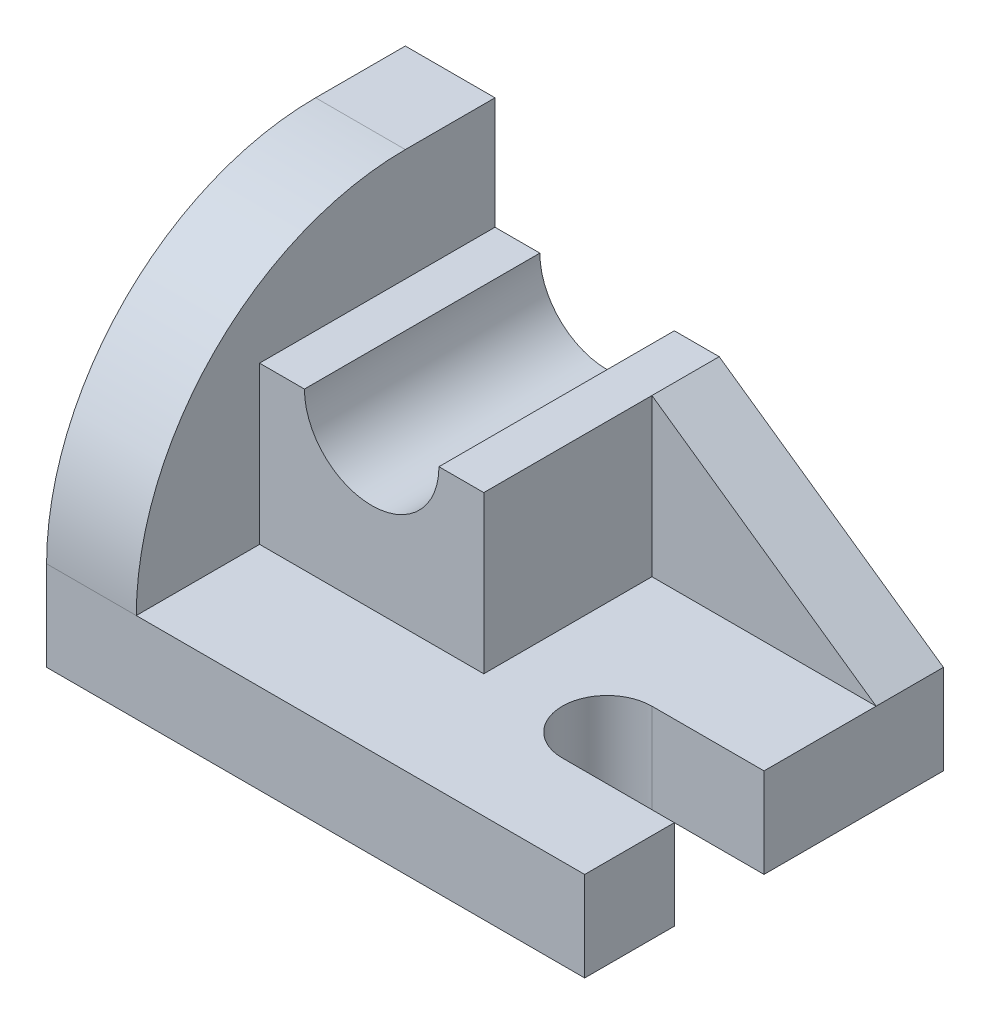
ISO-10303-21;
HEADER;
FILE_DESCRIPTION(('STEP AP214'),'2;1');
FILE_NAME('part.step','',(''),(''),'','','');
FILE_SCHEMA(('AUTOMOTIVE_DESIGN { 1 0 10303 214 1 1 1 1 }'));
ENDSEC;
DATA;
#1=APPLICATION_CONTEXT('core data for automotive mechanical design processes');
#2=APPLICATION_PROTOCOL_DEFINITION('international standard','automotive_design',2000,#1);
#3=PRODUCT_CONTEXT('',#1,'mechanical');
#4=PRODUCT('Part','Part','',(#3));
#5=PRODUCT_RELATED_PRODUCT_CATEGORY('part','',(#4));
#6=PRODUCT_DEFINITION_FORMATION('','',#4);
#7=PRODUCT_DEFINITION_CONTEXT('part definition',#1,'design');
#8=PRODUCT_DEFINITION('design','',#6,#7);
#9=PRODUCT_DEFINITION_SHAPE('','',#8);
#10=(LENGTH_UNIT() NAMED_UNIT(*) SI_UNIT(.MILLI.,.METRE.));
#11=(NAMED_UNIT(*) PLANE_ANGLE_UNIT() SI_UNIT($,.RADIAN.));
#12=(NAMED_UNIT(*) SI_UNIT($,.STERADIAN.) SOLID_ANGLE_UNIT());
#13=UNCERTAINTY_MEASURE_WITH_UNIT(LENGTH_MEASURE(1.E-05),#10,'distance_accuracy_value','');
#14=(GEOMETRIC_REPRESENTATION_CONTEXT(3) GLOBAL_UNCERTAINTY_ASSIGNED_CONTEXT((#13)) GLOBAL_UNIT_ASSIGNED_CONTEXT((#10,
#11,#12)) REPRESENTATION_CONTEXT('',''));
#15=CARTESIAN_POINT('',(0.,0.,0.));
#16=DIRECTION('',(0.,0.,1.));
#17=DIRECTION('',(1.,0.,0.));
#18=AXIS2_PLACEMENT_3D('',#15,#16,#17);
#19=CARTESIAN_POINT('',(76.,16.,-24.));
#20=DIRECTION('',(0.,1.,0.));
#21=DIRECTION('',(0.,0.,1.));
#22=AXIS2_PLACEMENT_3D('',#19,#20,#21);
#23=PLANE('',#22);
#24=DIRECTION('',(0.,0.,-1.));
#25=VECTOR('',#24,1.);
#26=CARTESIAN_POINT('',(96.,16.,-32.));
#27=LINE('',#26,#25);
#28=CARTESIAN_POINT('',(96.,16.,-32.));
#29=VERTEX_POINT('',#28);
#30=CARTESIAN_POINT('',(96.,16.,-52.));
#31=VERTEX_POINT('',#30);
#32=EDGE_CURVE('E176',#29,#31,#27,.T.);
#33=ORIENTED_EDGE('',*,*,#32,.T.);
#34=DIRECTION('',(-1.,0.,0.));
#35=VECTOR('',#34,1.);
#36=CARTESIAN_POINT('',(96.,16.,-52.));
#37=LINE('',#36,#35);
#38=CARTESIAN_POINT('',(56.,16.,-52.));
#39=VERTEX_POINT('',#38);
#40=EDGE_CURVE('E161',#31,#39,#37,.T.);
#41=ORIENTED_EDGE('',*,*,#40,.T.);
#42=DIRECTION('',(0.,0.,-1.));
#43=VECTOR('',#42,1.);
#44=CARTESIAN_POINT('',(56.,16.,-22.));
#45=LINE('',#44,#43);
#46=CARTESIAN_POINT('',(56.,16.,-22.));
#47=VERTEX_POINT('',#46);
#48=EDGE_CURVE('E271',#47,#39,#45,.T.);
#49=ORIENTED_EDGE('',*,*,#48,.F.);
#50=DIRECTION('',(1.,0.,0.));
#51=VECTOR('',#50,1.);
#52=CARTESIAN_POINT('',(16.,16.,-22.));
#53=LINE('',#52,#51);
#54=CARTESIAN_POINT('',(16.,16.,-22.));
#55=VERTEX_POINT('',#54);
#56=EDGE_CURVE('E299',#55,#47,#53,.T.);
#57=ORIENTED_EDGE('',*,*,#56,.F.);
#58=DIRECTION('',(0.,0.,1.));
#59=VECTOR('',#58,1.);
#60=CARTESIAN_POINT('',(16.,16.,-64.));
#61=LINE('',#60,#59);
#62=CARTESIAN_POINT('',(16.,16.,0.));
#63=VERTEX_POINT('',#62);
#64=EDGE_CURVE('E263',#55,#63,#61,.T.);
#65=ORIENTED_EDGE('',*,*,#64,.T.);
#66=DIRECTION('',(1.,0.,0.));
#67=VECTOR('',#66,1.);
#68=CARTESIAN_POINT('',(0.,16.,0.));
#69=LINE('',#68,#67);
#70=CARTESIAN_POINT('',(96.,16.,0.));
#71=VERTEX_POINT('',#70);
#72=EDGE_CURVE('E199',#63,#71,#69,.T.);
#73=ORIENTED_EDGE('',*,*,#72,.T.);
#74=DIRECTION('',(0.,0.,-1.));
#75=VECTOR('',#74,1.);
#76=CARTESIAN_POINT('',(96.,16.,0.));
#77=LINE('',#76,#75);
#78=CARTESIAN_POINT('',(96.,16.,-16.));
#79=VERTEX_POINT('',#78);
#80=EDGE_CURVE('E196',#71,#79,#77,.T.);
#81=ORIENTED_EDGE('',*,*,#80,.T.);
#82=DIRECTION('',(-1.,0.,0.));
#83=VECTOR('',#82,1.);
#84=CARTESIAN_POINT('',(96.,16.,-16.));
#85=LINE('',#84,#83);
#86=CARTESIAN_POINT('',(76.,16.,-16.));
#87=VERTEX_POINT('',#86);
#88=EDGE_CURVE('E198',#79,#87,#85,.T.);
#89=ORIENTED_EDGE('',*,*,#88,.T.);
#90=CARTESIAN_POINT('',(76.,16.,-24.));
#91=DIRECTION('',(0.,1.,0.));
#92=DIRECTION('',(0.,0.,1.));
#93=AXIS2_PLACEMENT_3D('',#90,#91,#92);
#94=CIRCLE('',#93,8.);
#95=CARTESIAN_POINT('',(76.,16.,-32.));
#96=VERTEX_POINT('',#95);
#97=EDGE_CURVE('E189',#96,#87,#94,.T.);
#98=ORIENTED_EDGE('',*,*,#97,.F.);
#99=DIRECTION('',(-1.,0.,0.));
#100=VECTOR('',#99,1.);
#101=CARTESIAN_POINT('',(96.,16.,-32.));
#102=LINE('',#101,#100);
#103=EDGE_CURVE('E181',#29,#96,#102,.T.);
#104=ORIENTED_EDGE('',*,*,#103,.F.);
#105=EDGE_LOOP('',(#33,#41,#49,#57,#65,#73,#81,#89,#98,#104));
#106=FACE_BOUND('',#105,.T.);
#107=ADVANCED_FACE('F39',(#106),#23,.T.);
#108=CARTESIAN_POINT('',(0.,16.,0.));
#109=DIRECTION('',(-1.,0.,0.));
#110=DIRECTION('',(0.,0.,1.));
#111=AXIS2_PLACEMENT_3D('',#108,#109,#110);
#112=PLANE('',#111);
#113=DIRECTION('',(0.,0.,-1.));
#114=VECTOR('',#113,1.);
#115=CARTESIAN_POINT('',(0.,0.,0.));
#116=LINE('',#115,#114);
#117=CARTESIAN_POINT('',(0.,0.,0.));
#118=VERTEX_POINT('',#117);
#119=CARTESIAN_POINT('',(0.,0.,-64.));
#120=VERTEX_POINT('',#119);
#121=EDGE_CURVE('E204',#118,#120,#116,.T.);
#122=ORIENTED_EDGE('',*,*,#121,.F.);
#123=DIRECTION('',(0.,-1.,0.));
#124=VECTOR('',#123,1.);
#125=CARTESIAN_POINT('',(0.,16.,0.));
#126=LINE('',#125,#124);
#127=CARTESIAN_POINT('',(0.,16.,0.));
#128=VERTEX_POINT('',#127);
#129=EDGE_CURVE('E11',#128,#118,#126,.T.);
#130=ORIENTED_EDGE('',*,*,#129,.F.);
#131=CARTESIAN_POINT('',(0.,16.,-48.));
#132=DIRECTION('',(-1.,0.,0.));
#133=DIRECTION('',(0.,0.,1.));
#134=AXIS2_PLACEMENT_3D('',#131,#132,#133);
#135=CIRCLE('',#134,48.);
#136=CARTESIAN_POINT('',(0.,64.,-48.));
#137=VERTEX_POINT('',#136);
#138=EDGE_CURVE('E269',#128,#137,#135,.T.);
#139=ORIENTED_EDGE('',*,*,#138,.T.);
#140=DIRECTION('',(0.,0.,-1.));
#141=VECTOR('',#140,1.);
#142=CARTESIAN_POINT('',(0.,64.,-64.));
#143=LINE('',#142,#141);
#144=CARTESIAN_POINT('',(0.,64.,-64.));
#145=VERTEX_POINT('',#144);
#146=EDGE_CURVE('E244',#137,#145,#143,.T.);
#147=ORIENTED_EDGE('',*,*,#146,.T.);
#148=DIRECTION('',(0.,-1.,0.));
#149=VECTOR('',#148,1.);
#150=CARTESIAN_POINT('',(0.,16.,-64.));
#151=LINE('',#150,#149);
#152=EDGE_CURVE('E43',#145,#120,#151,.T.);
#153=ORIENTED_EDGE('',*,*,#152,.T.);
#154=EDGE_LOOP('',(#122,#130,#139,#147,#153));
#155=FACE_BOUND('',#154,.T.);
#156=ADVANCED_FACE('F41',(#155),#112,.T.);
#157=CARTESIAN_POINT('',(0.,16.,0.));
#158=DIRECTION('',(0.,0.,-1.));
#159=DIRECTION('',(-1.,0.,0.));
#160=AXIS2_PLACEMENT_3D('',#157,#158,#159);
#161=PLANE('',#160);
#162=DIRECTION('',(1.,0.,0.));
#163=VECTOR('',#162,1.);
#164=CARTESIAN_POINT('',(0.,0.,0.));
#165=LINE('',#164,#163);
#166=CARTESIAN_POINT('',(96.,0.,0.));
#167=VERTEX_POINT('',#166);
#168=EDGE_CURVE('E184',#118,#167,#165,.T.);
#169=ORIENTED_EDGE('',*,*,#168,.T.);
#170=DIRECTION('',(0.,-1.,0.));
#171=VECTOR('',#170,1.);
#172=CARTESIAN_POINT('',(96.,16.,0.));
#173=LINE('',#172,#171);
#174=EDGE_CURVE('E48',#71,#167,#173,.T.);
#175=ORIENTED_EDGE('',*,*,#174,.F.);
#176=ORIENTED_EDGE('',*,*,#72,.F.);
#177=EDGE_CURVE('E203',#128,#63,#69,.T.);
#178=ORIENTED_EDGE('',*,*,#177,.F.);
#179=ORIENTED_EDGE('',*,*,#129,.T.);
#180=EDGE_LOOP('',(#169,#175,#176,#178,#179));
#181=FACE_BOUND('',#180,.T.);
#182=ADVANCED_FACE('F252',(#181),#161,.F.);
#183=CARTESIAN_POINT('',(96.,16.,0.));
#184=DIRECTION('',(-1.,0.,0.));
#185=DIRECTION('',(0.,0.,1.));
#186=AXIS2_PLACEMENT_3D('',#183,#184,#185);
#187=PLANE('',#186);
#188=DIRECTION('',(0.,0.,-1.));
#189=VECTOR('',#188,1.);
#190=CARTESIAN_POINT('',(96.,0.,0.));
#191=LINE('',#190,#189);
#192=CARTESIAN_POINT('',(96.,0.,-16.));
#193=VERTEX_POINT('',#192);
#194=EDGE_CURVE('E190',#167,#193,#191,.T.);
#195=ORIENTED_EDGE('',*,*,#194,.T.);
#196=DIRECTION('',(0.,-1.,0.));
#197=VECTOR('',#196,1.);
#198=CARTESIAN_POINT('',(96.,16.,-16.));
#199=LINE('',#198,#197);
#200=EDGE_CURVE('E223',#79,#193,#199,.T.);
#201=ORIENTED_EDGE('',*,*,#200,.F.);
#202=ORIENTED_EDGE('',*,*,#80,.F.);
#203=ORIENTED_EDGE('',*,*,#174,.T.);
#204=EDGE_LOOP('',(#195,#201,#202,#203));
#205=FACE_BOUND('',#204,.T.);
#206=ADVANCED_FACE('F260',(#205),#187,.F.);
#207=CARTESIAN_POINT('',(96.,16.,-16.));
#208=DIRECTION('',(0.,0.,1.));
#209=DIRECTION('',(1.,0.,0.));
#210=AXIS2_PLACEMENT_3D('',#207,#208,#209);
#211=PLANE('',#210);
#212=DIRECTION('',(-1.,0.,0.));
#213=VECTOR('',#212,1.);
#214=CARTESIAN_POINT('',(96.,0.,-16.));
#215=LINE('',#214,#213);
#216=CARTESIAN_POINT('',(76.,0.,-16.));
#217=VERTEX_POINT('',#216);
#218=EDGE_CURVE('E218',#193,#217,#215,.T.);
#219=ORIENTED_EDGE('',*,*,#218,.T.);
#220=DIRECTION('',(0.,-1.,0.));
#221=VECTOR('',#220,1.);
#222=CARTESIAN_POINT('',(76.,16.,-16.));
#223=LINE('',#222,#221);
#224=EDGE_CURVE('E230',#87,#217,#223,.T.);
#225=ORIENTED_EDGE('',*,*,#224,.F.);
#226=ORIENTED_EDGE('',*,*,#88,.F.);
#227=ORIENTED_EDGE('',*,*,#200,.T.);
#228=EDGE_LOOP('',(#219,#225,#226,#227));
#229=FACE_BOUND('',#228,.T.);
#230=ADVANCED_FACE('F362',(#229),#211,.F.);
#231=CARTESIAN_POINT('',(76.,16.,-24.));
#232=DIRECTION('',(0.,-1.,0.));
#233=DIRECTION('',(0.,0.,-1.));
#234=AXIS2_PLACEMENT_3D('',#231,#232,#233);
#235=CYLINDRICAL_SURFACE('',#234,8.);
#236=CARTESIAN_POINT('',(76.,0.,-24.));
#237=DIRECTION('',(0.,1.,0.));
#238=DIRECTION('',(0.,0.,1.));
#239=AXIS2_PLACEMENT_3D('',#236,#237,#238);
#240=CIRCLE('',#239,8.);
#241=CARTESIAN_POINT('',(76.,0.,-32.));
#242=VERTEX_POINT('',#241);
#243=EDGE_CURVE('E216',#242,#217,#240,.T.);
#244=ORIENTED_EDGE('',*,*,#243,.F.);
#245=DIRECTION('',(0.,-1.,0.));
#246=VECTOR('',#245,1.);
#247=CARTESIAN_POINT('',(76.,16.,-32.));
#248=LINE('',#247,#246);
#249=EDGE_CURVE('E227',#96,#242,#248,.T.);
#250=ORIENTED_EDGE('',*,*,#249,.F.);
#251=ORIENTED_EDGE('',*,*,#97,.T.);
#252=ORIENTED_EDGE('',*,*,#224,.T.);
#253=EDGE_LOOP('',(#244,#250,#251,#252));
#254=FACE_BOUND('',#253,.T.);
#255=ADVANCED_FACE('F364',(#254),#235,.F.);
#256=CARTESIAN_POINT('',(96.,16.,-32.));
#257=DIRECTION('',(0.,0.,1.));
#258=DIRECTION('',(1.,0.,0.));
#259=AXIS2_PLACEMENT_3D('',#256,#257,#258);
#260=PLANE('',#259);
#261=DIRECTION('',(-1.,0.,0.));
#262=VECTOR('',#261,1.);
#263=CARTESIAN_POINT('',(96.,0.,-32.));
#264=LINE('',#263,#262);
#265=CARTESIAN_POINT('',(96.,0.,-32.));
#266=VERTEX_POINT('',#265);
#267=EDGE_CURVE('E213',#266,#242,#264,.T.);
#268=ORIENTED_EDGE('',*,*,#267,.F.);
#269=DIRECTION('',(0.,-1.,0.));
#270=VECTOR('',#269,1.);
#271=CARTESIAN_POINT('',(96.,16.,-32.));
#272=LINE('',#271,#270);
#273=EDGE_CURVE('E232',#29,#266,#272,.T.);
#274=ORIENTED_EDGE('',*,*,#273,.F.);
#275=ORIENTED_EDGE('',*,*,#103,.T.);
#276=ORIENTED_EDGE('',*,*,#249,.T.);
#277=EDGE_LOOP('',(#268,#274,#275,#276));
#278=FACE_BOUND('',#277,.T.);
#279=ADVANCED_FACE('F369',(#278),#260,.T.);
#280=CARTESIAN_POINT('',(96.,16.,-32.));
#281=DIRECTION('',(-1.,0.,0.));
#282=DIRECTION('',(0.,0.,1.));
#283=AXIS2_PLACEMENT_3D('',#280,#281,#282);
#284=PLANE('',#283);
#285=DIRECTION('',(0.,0.,-1.));
#286=VECTOR('',#285,1.);
#287=CARTESIAN_POINT('',(96.,0.,-32.));
#288=LINE('',#287,#286);
#289=CARTESIAN_POINT('',(96.,0.,-64.));
#290=VERTEX_POINT('',#289);
#291=EDGE_CURVE('E211',#266,#290,#288,.T.);
#292=ORIENTED_EDGE('',*,*,#291,.T.);
#293=DIRECTION('',(0.,-1.,0.));
#294=VECTOR('',#293,1.);
#295=CARTESIAN_POINT('',(96.,16.,-64.));
#296=LINE('',#295,#294);
#297=CARTESIAN_POINT('',(96.,16.,-64.));
#298=VERTEX_POINT('',#297);
#299=EDGE_CURVE('E179',#298,#290,#296,.T.);
#300=ORIENTED_EDGE('',*,*,#299,.F.);
#301=DIRECTION('',(0.,0.,-1.));
#302=VECTOR('',#301,1.);
#303=CARTESIAN_POINT('',(96.,16.,-52.));
#304=LINE('',#303,#302);
#305=EDGE_CURVE('E156',#31,#298,#304,.T.);
#306=ORIENTED_EDGE('',*,*,#305,.F.);
#307=ORIENTED_EDGE('',*,*,#32,.F.);
#308=ORIENTED_EDGE('',*,*,#273,.T.);
#309=EDGE_LOOP('',(#292,#300,#306,#307,#308));
#310=FACE_BOUND('',#309,.T.);
#311=ADVANCED_FACE('F172',(#310),#284,.F.);
#312=CARTESIAN_POINT('',(0.,16.,-64.));
#313=DIRECTION('',(0.,0.,-1.));
#314=DIRECTION('',(-1.,0.,0.));
#315=AXIS2_PLACEMENT_3D('',#312,#313,#314);
#316=PLANE('',#315);
#317=DIRECTION('',(0.819231920519041,-0.573462344363328,0.));
#318=VECTOR('',#317,1.);
#319=CARTESIAN_POINT('',(56.,44.,-64.));
#320=LINE('',#319,#318);
#321=CARTESIAN_POINT('',(56.,44.,-64.));
#322=VERTEX_POINT('',#321);
#323=EDGE_CURVE('E320',#322,#298,#320,.T.);
#324=ORIENTED_EDGE('',*,*,#323,.T.);
#325=ORIENTED_EDGE('',*,*,#299,.T.);
#326=DIRECTION('',(1.,0.,0.));
#327=VECTOR('',#326,1.);
#328=CARTESIAN_POINT('',(0.,0.,-64.));
#329=LINE('',#328,#327);
#330=EDGE_CURVE('E210',#120,#290,#329,.T.);
#331=ORIENTED_EDGE('',*,*,#330,.F.);
#332=ORIENTED_EDGE('',*,*,#152,.F.);
#333=DIRECTION('',(-1.,0.,0.));
#334=VECTOR('',#333,1.);
#335=CARTESIAN_POINT('',(16.,64.,-64.));
#336=LINE('',#335,#334);
#337=CARTESIAN_POINT('',(16.,64.,-64.));
#338=VERTEX_POINT('',#337);
#339=EDGE_CURVE('E208',#338,#145,#336,.T.);
#340=ORIENTED_EDGE('',*,*,#339,.F.);
#341=DIRECTION('',(0.,-1.,0.));
#342=VECTOR('',#341,1.);
#343=CARTESIAN_POINT('',(16.,16.,-64.));
#344=LINE('',#343,#342);
#345=CARTESIAN_POINT('',(16.,44.,-64.));
#346=VERTEX_POINT('',#345);
#347=EDGE_CURVE('E272',#338,#346,#344,.T.);
#348=ORIENTED_EDGE('',*,*,#347,.T.);
#349=DIRECTION('',(1.,0.,0.));
#350=VECTOR('',#349,1.);
#351=CARTESIAN_POINT('',(16.,44.,-64.));
#352=LINE('',#351,#350);
#353=CARTESIAN_POINT('',(24.,44.,-64.));
#354=VERTEX_POINT('',#353);
#355=EDGE_CURVE('E63',#346,#354,#352,.T.);
#356=ORIENTED_EDGE('',*,*,#355,.T.);
#357=CARTESIAN_POINT('',(36.,44.,-64.));
#358=DIRECTION('',(0.,0.,-1.));
#359=DIRECTION('',(-1.,0.,0.));
#360=AXIS2_PLACEMENT_3D('',#357,#358,#359);
#361=CIRCLE('',#360,12.);
#362=CARTESIAN_POINT('',(48.,44.,-64.));
#363=VERTEX_POINT('',#362);
#364=EDGE_CURVE('E296',#363,#354,#361,.T.);
#365=ORIENTED_EDGE('',*,*,#364,.F.);
#366=DIRECTION('',(1.,0.,0.));
#367=VECTOR('',#366,1.);
#368=CARTESIAN_POINT('',(48.,44.,-64.));
#369=LINE('',#368,#367);
#370=EDGE_CURVE('E178',#363,#322,#369,.T.);
#371=ORIENTED_EDGE('',*,*,#370,.T.);
#372=EDGE_LOOP('',(#324,#325,#331,#332,#340,#348,#356,#365,#371));
#373=FACE_BOUND('',#372,.T.);
#374=ADVANCED_FACE('F245',(#373),#316,.T.);
#375=CARTESIAN_POINT('',(76.,0.,-24.));
#376=DIRECTION('',(0.,1.,0.));
#377=DIRECTION('',(0.,0.,1.));
#378=AXIS2_PLACEMENT_3D('',#375,#376,#377);
#379=PLANE('',#378);
#380=ORIENTED_EDGE('',*,*,#121,.T.);
#381=ORIENTED_EDGE('',*,*,#330,.T.);
#382=ORIENTED_EDGE('',*,*,#291,.F.);
#383=ORIENTED_EDGE('',*,*,#267,.T.);
#384=ORIENTED_EDGE('',*,*,#243,.T.);
#385=ORIENTED_EDGE('',*,*,#218,.F.);
#386=ORIENTED_EDGE('',*,*,#194,.F.);
#387=ORIENTED_EDGE('',*,*,#168,.F.);
#388=EDGE_LOOP('',(#380,#381,#382,#383,#384,#385,#386,#387));
#389=FACE_BOUND('',#388,.T.);
#390=ADVANCED_FACE('F247',(#389),#379,.F.);
#391=CARTESIAN_POINT('',(16.,64.,-64.));
#392=DIRECTION('',(0.,1.,0.));
#393=DIRECTION('',(0.,0.,1.));
#394=AXIS2_PLACEMENT_3D('',#391,#392,#393);
#395=PLANE('',#394);
#396=ORIENTED_EDGE('',*,*,#146,.F.);
#397=DIRECTION('',(-1.,0.,0.));
#398=VECTOR('',#397,1.);
#399=CARTESIAN_POINT('',(16.,64.,-48.));
#400=LINE('',#399,#398);
#401=CARTESIAN_POINT('',(16.,64.,-48.));
#402=VERTEX_POINT('',#401);
#403=EDGE_CURVE('E191',#402,#137,#400,.T.);
#404=ORIENTED_EDGE('',*,*,#403,.F.);
#405=DIRECTION('',(0.,0.,-1.));
#406=VECTOR('',#405,1.);
#407=CARTESIAN_POINT('',(16.,64.,-64.));
#408=LINE('',#407,#406);
#409=EDGE_CURVE('E279',#402,#338,#408,.T.);
#410=ORIENTED_EDGE('',*,*,#409,.T.);
#411=ORIENTED_EDGE('',*,*,#339,.T.);
#412=EDGE_LOOP('',(#396,#404,#410,#411));
#413=FACE_BOUND('',#412,.T.);
#414=ADVANCED_FACE('F357',(#413),#395,.T.);
#415=CARTESIAN_POINT('',(16.,16.,-48.));
#416=DIRECTION('',(-1.,0.,0.));
#417=DIRECTION('',(0.,0.,1.));
#418=AXIS2_PLACEMENT_3D('',#415,#416,#417);
#419=CYLINDRICAL_SURFACE('',#418,48.);
#420=ORIENTED_EDGE('',*,*,#138,.F.);
#421=ORIENTED_EDGE('',*,*,#177,.T.);
#422=CARTESIAN_POINT('',(16.,16.,-48.));
#423=DIRECTION('',(-1.,0.,0.));
#424=DIRECTION('',(0.,0.,1.));
#425=AXIS2_PLACEMENT_3D('',#422,#423,#424);
#426=CIRCLE('',#425,48.);
#427=EDGE_CURVE('E268',#63,#402,#426,.T.);
#428=ORIENTED_EDGE('',*,*,#427,.T.);
#429=ORIENTED_EDGE('',*,*,#403,.T.);
#430=EDGE_LOOP('',(#420,#421,#428,#429));
#431=FACE_BOUND('',#430,.T.);
#432=ADVANCED_FACE('F270',(#431),#419,.T.);
#433=CARTESIAN_POINT('',(16.,16.,-48.));
#434=DIRECTION('',(-1.,0.,0.));
#435=DIRECTION('',(0.,0.,1.));
#436=AXIS2_PLACEMENT_3D('',#433,#434,#435);
#437=PLANE('',#436);
#438=ORIENTED_EDGE('',*,*,#64,.F.);
#439=DIRECTION('',(0.,1.,0.));
#440=VECTOR('',#439,1.);
#441=CARTESIAN_POINT('',(16.,16.,-22.));
#442=LINE('',#441,#440);
#443=CARTESIAN_POINT('',(16.,44.,-22.));
#444=VERTEX_POINT('',#443);
#445=EDGE_CURVE('E294',#55,#444,#442,.T.);
#446=ORIENTED_EDGE('',*,*,#445,.T.);
#447=DIRECTION('',(0.,0.,-1.));
#448=VECTOR('',#447,1.);
#449=CARTESIAN_POINT('',(16.,44.,-22.));
#450=LINE('',#449,#448);
#451=EDGE_CURVE('E295',#444,#346,#450,.T.);
#452=ORIENTED_EDGE('',*,*,#451,.T.);
#453=ORIENTED_EDGE('',*,*,#347,.F.);
#454=ORIENTED_EDGE('',*,*,#409,.F.);
#455=ORIENTED_EDGE('',*,*,#427,.F.);
#456=EDGE_LOOP('',(#438,#446,#452,#453,#454,#455));
#457=FACE_BOUND('',#456,.T.);
#458=ADVANCED_FACE('F335',(#457),#437,.F.);
#459=CARTESIAN_POINT('',(56.,16.,-22.));
#460=DIRECTION('',(-1.,0.,0.));
#461=DIRECTION('',(0.,0.,1.));
#462=AXIS2_PLACEMENT_3D('',#459,#460,#461);
#463=PLANE('',#462);
#464=ORIENTED_EDGE('',*,*,#48,.T.);
#465=DIRECTION('',(0.,1.,0.));
#466=VECTOR('',#465,1.);
#467=CARTESIAN_POINT('',(56.,16.,-52.));
#468=LINE('',#467,#466);
#469=CARTESIAN_POINT('',(56.,44.,-52.));
#470=VERTEX_POINT('',#469);
#471=EDGE_CURVE('E165',#39,#470,#468,.T.);
#472=ORIENTED_EDGE('',*,*,#471,.T.);
#473=DIRECTION('',(0.,0.,-1.));
#474=VECTOR('',#473,1.);
#475=CARTESIAN_POINT('',(56.,44.,-22.));
#476=LINE('',#475,#474);
#477=CARTESIAN_POINT('',(56.,44.,-22.));
#478=VERTEX_POINT('',#477);
#479=EDGE_CURVE('E274',#478,#470,#476,.T.);
#480=ORIENTED_EDGE('',*,*,#479,.F.);
#481=DIRECTION('',(0.,1.,0.));
#482=VECTOR('',#481,1.);
#483=CARTESIAN_POINT('',(56.,16.,-22.));
#484=LINE('',#483,#482);
#485=EDGE_CURVE('E315',#47,#478,#484,.T.);
#486=ORIENTED_EDGE('',*,*,#485,.F.);
#487=EDGE_LOOP('',(#464,#472,#480,#486));
#488=FACE_BOUND('',#487,.T.);
#489=ADVANCED_FACE('F321',(#488),#463,.F.);
#490=CARTESIAN_POINT('',(48.,44.,-22.));
#491=DIRECTION('',(0.,1.,0.));
#492=DIRECTION('',(0.,0.,1.));
#493=AXIS2_PLACEMENT_3D('',#490,#491,#492);
#494=PLANE('',#493);
#495=ORIENTED_EDGE('',*,*,#370,.F.);
#496=DIRECTION('',(0.,0.,-1.));
#497=VECTOR('',#496,1.);
#498=CARTESIAN_POINT('',(48.,44.,-22.));
#499=LINE('',#498,#497);
#500=CARTESIAN_POINT('',(48.,44.,-22.));
#501=VERTEX_POINT('',#500);
#502=EDGE_CURVE('E289',#501,#363,#499,.T.);
#503=ORIENTED_EDGE('',*,*,#502,.F.);
#504=DIRECTION('',(1.,0.,0.));
#505=VECTOR('',#504,1.);
#506=CARTESIAN_POINT('',(48.,44.,-22.));
#507=LINE('',#506,#505);
#508=EDGE_CURVE('E310',#501,#478,#507,.T.);
#509=ORIENTED_EDGE('',*,*,#508,.T.);
#510=ORIENTED_EDGE('',*,*,#479,.T.);
#511=DIRECTION('',(0.,0.,-1.));
#512=VECTOR('',#511,1.);
#513=CARTESIAN_POINT('',(56.,44.,-52.));
#514=LINE('',#513,#512);
#515=EDGE_CURVE('E157',#470,#322,#514,.T.);
#516=ORIENTED_EDGE('',*,*,#515,.T.);
#517=EDGE_LOOP('',(#495,#503,#509,#510,#516));
#518=FACE_BOUND('',#517,.T.);
#519=ADVANCED_FACE('F322',(#518),#494,.T.);
#520=CARTESIAN_POINT('',(36.,44.,-22.));
#521=DIRECTION('',(0.,0.,-1.));
#522=DIRECTION('',(-1.,0.,0.));
#523=AXIS2_PLACEMENT_3D('',#520,#521,#522);
#524=CYLINDRICAL_SURFACE('',#523,12.);
#525=ORIENTED_EDGE('',*,*,#364,.T.);
#526=DIRECTION('',(0.,0.,-1.));
#527=VECTOR('',#526,1.);
#528=CARTESIAN_POINT('',(24.,44.,-22.));
#529=LINE('',#528,#527);
#530=CARTESIAN_POINT('',(24.,44.,-22.));
#531=VERTEX_POINT('',#530);
#532=EDGE_CURVE('E290',#531,#354,#529,.T.);
#533=ORIENTED_EDGE('',*,*,#532,.F.);
#534=CARTESIAN_POINT('',(36.,44.,-22.));
#535=DIRECTION('',(0.,0.,-1.));
#536=DIRECTION('',(-1.,0.,0.));
#537=AXIS2_PLACEMENT_3D('',#534,#535,#536);
#538=CIRCLE('',#537,12.);
#539=EDGE_CURVE('E307',#501,#531,#538,.T.);
#540=ORIENTED_EDGE('',*,*,#539,.F.);
#541=ORIENTED_EDGE('',*,*,#502,.T.);
#542=EDGE_LOOP('',(#525,#533,#540,#541));
#543=FACE_BOUND('',#542,.T.);
#544=ADVANCED_FACE('F339',(#543),#524,.F.);
#545=CARTESIAN_POINT('',(16.,44.,-22.));
#546=DIRECTION('',(0.,1.,0.));
#547=DIRECTION('',(-1.,0.,0.));
#548=AXIS2_PLACEMENT_3D('',#545,#546,#547);
#549=PLANE('',#548);
#550=ORIENTED_EDGE('',*,*,#355,.F.);
#551=ORIENTED_EDGE('',*,*,#451,.F.);
#552=DIRECTION('',(1.,0.,0.));
#553=VECTOR('',#552,1.);
#554=CARTESIAN_POINT('',(16.,44.,-22.));
#555=LINE('',#554,#553);
#556=EDGE_CURVE('E303',#444,#531,#555,.T.);
#557=ORIENTED_EDGE('',*,*,#556,.T.);
#558=ORIENTED_EDGE('',*,*,#532,.T.);
#559=EDGE_LOOP('',(#550,#551,#557,#558));
#560=FACE_BOUND('',#559,.T.);
#561=ADVANCED_FACE('F336',(#560),#549,.T.);
#562=CARTESIAN_POINT('',(36.,44.,-22.));
#563=DIRECTION('',(0.,0.,-1.));
#564=DIRECTION('',(-1.,0.,0.));
#565=AXIS2_PLACEMENT_3D('',#562,#563,#564);
#566=PLANE('',#565);
#567=ORIENTED_EDGE('',*,*,#56,.T.);
#568=ORIENTED_EDGE('',*,*,#485,.T.);
#569=ORIENTED_EDGE('',*,*,#508,.F.);
#570=ORIENTED_EDGE('',*,*,#539,.T.);
#571=ORIENTED_EDGE('',*,*,#556,.F.);
#572=ORIENTED_EDGE('',*,*,#445,.F.);
#573=EDGE_LOOP('',(#567,#568,#569,#570,#571,#572));
#574=FACE_BOUND('',#573,.T.);
#575=ADVANCED_FACE('F327',(#574),#566,.F.);
#576=CARTESIAN_POINT('',(56.,44.,-52.));
#577=DIRECTION('',(0.573462344363328,0.81923192051904,0.));
#578=DIRECTION('',(-0.819231920519041,0.573462344363328,0.));
#579=AXIS2_PLACEMENT_3D('',#576,#577,#578);
#580=PLANE('',#579);
#581=ORIENTED_EDGE('',*,*,#323,.F.);
#582=ORIENTED_EDGE('',*,*,#515,.F.);
#583=DIRECTION('',(0.819231920519041,-0.573462344363328,0.));
#584=VECTOR('',#583,1.);
#585=CARTESIAN_POINT('',(56.,44.,-52.));
#586=LINE('',#585,#584);
#587=EDGE_CURVE('E57',#470,#31,#586,.T.);
#588=ORIENTED_EDGE('',*,*,#587,.T.);
#589=ORIENTED_EDGE('',*,*,#305,.T.);
#590=EDGE_LOOP('',(#581,#582,#588,#589));
#591=FACE_BOUND('',#590,.T.);
#592=ADVANCED_FACE('F152',(#591),#580,.T.);
#593=CARTESIAN_POINT('',(0.,0.,-52.));
#594=DIRECTION('',(0.,0.,1.));
#595=DIRECTION('',(1.,0.,0.));
#596=AXIS2_PLACEMENT_3D('',#593,#594,#595);
#597=PLANE('',#596);
#598=ORIENTED_EDGE('',*,*,#471,.F.);
#599=ORIENTED_EDGE('',*,*,#40,.F.);
#600=ORIENTED_EDGE('',*,*,#587,.F.);
#601=EDGE_LOOP('',(#598,#599,#600));
#602=FACE_BOUND('',#601,.T.);
#603=ADVANCED_FACE('F164',(#602),#597,.T.);
#604=CLOSED_SHELL('',(#107,#156,#182,#206,#230,#255,#279,#311,#374,#390,#414,#432,#458,#489,
#519,#544,#561,#575,#592,#603));
#605=MANIFOLD_SOLID_BREP('B2',#604);
#606=ADVANCED_BREP_SHAPE_REPRESENTATION('',(#18,#605),#14);
#607=SHAPE_DEFINITION_REPRESENTATION(#9,#606);
ENDSEC;
END-ISO-10303-21;
